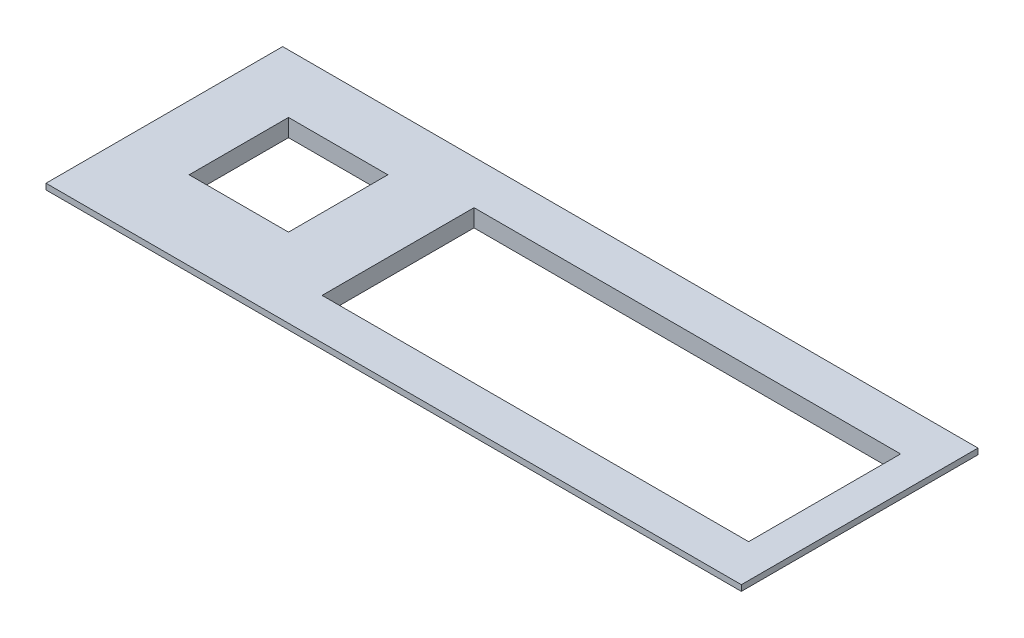
ISO-10303-21;
HEADER;
FILE_DESCRIPTION(('STEP AP214'),'2;1');
FILE_NAME('part.step','',(''),(''),'','','');
FILE_SCHEMA(('AUTOMOTIVE_DESIGN { 1 0 10303 214 1 1 1 1 }'));
ENDSEC;
DATA;
#1=APPLICATION_CONTEXT('core data for automotive mechanical design processes');
#2=APPLICATION_PROTOCOL_DEFINITION('international standard','automotive_design',2000,#1);
#3=PRODUCT_CONTEXT('',#1,'mechanical');
#4=PRODUCT('Part','Part','',(#3));
#5=PRODUCT_RELATED_PRODUCT_CATEGORY('part','',(#4));
#6=PRODUCT_DEFINITION_FORMATION('','',#4);
#7=PRODUCT_DEFINITION_CONTEXT('part definition',#1,'design');
#8=PRODUCT_DEFINITION('design','',#6,#7);
#9=PRODUCT_DEFINITION_SHAPE('','',#8);
#10=(LENGTH_UNIT() NAMED_UNIT(*) SI_UNIT(.MILLI.,.METRE.));
#11=(NAMED_UNIT(*) PLANE_ANGLE_UNIT() SI_UNIT($,.RADIAN.));
#12=(NAMED_UNIT(*) SI_UNIT($,.STERADIAN.) SOLID_ANGLE_UNIT());
#13=UNCERTAINTY_MEASURE_WITH_UNIT(LENGTH_MEASURE(1.E-05),#10,'distance_accuracy_value','');
#14=(GEOMETRIC_REPRESENTATION_CONTEXT(3) GLOBAL_UNCERTAINTY_ASSIGNED_CONTEXT((#13)) GLOBAL_UNIT_ASSIGNED_CONTEXT((#10,
#11,#12)) REPRESENTATION_CONTEXT('',''));
#15=CARTESIAN_POINT('',(0.,0.,0.));
#16=DIRECTION('',(0.,0.,1.));
#17=DIRECTION('',(1.,0.,0.));
#18=AXIS2_PLACEMENT_3D('',#15,#16,#17);
#19=CARTESIAN_POINT('',(0.,21.,0.));
#20=DIRECTION('',(0.,1.,0.));
#21=DIRECTION('',(0.,0.,1.));
#22=AXIS2_PLACEMENT_3D('',#19,#20,#21);
#23=PLANE('',#22);
#24=DIRECTION('',(1.,0.,0.));
#25=VECTOR('',#24,1.);
#26=CARTESIAN_POINT('',(-48.5,21.,6.75000000000001));
#27=LINE('',#26,#25);
#28=CARTESIAN_POINT('',(-48.5,21.,6.75000000000001));
#29=VERTEX_POINT('',#28);
#30=CARTESIAN_POINT('',(-31.5,21.,6.75000000000001));
#31=VERTEX_POINT('',#30);
#32=EDGE_CURVE('E264',#29,#31,#27,.T.);
#33=ORIENTED_EDGE('',*,*,#32,.T.);
#34=DIRECTION('',(0.,0.,-1.));
#35=VECTOR('',#34,1.);
#36=CARTESIAN_POINT('',(-31.5,21.,6.75000000000001));
#37=LINE('',#36,#35);
#38=CARTESIAN_POINT('',(-31.5,21.,-10.25));
#39=VERTEX_POINT('',#38);
#40=EDGE_CURVE('E259',#31,#39,#37,.T.);
#41=ORIENTED_EDGE('',*,*,#40,.T.);
#42=DIRECTION('',(-1.,0.,0.));
#43=VECTOR('',#42,1.);
#44=CARTESIAN_POINT('',(-48.5,21.,-10.25));
#45=LINE('',#44,#43);
#46=CARTESIAN_POINT('',(-48.5,21.,-10.25));
#47=VERTEX_POINT('',#46);
#48=EDGE_CURVE('E278',#39,#47,#45,.T.);
#49=ORIENTED_EDGE('',*,*,#48,.T.);
#50=DIRECTION('',(0.,0.,1.));
#51=VECTOR('',#50,1.);
#52=CARTESIAN_POINT('',(-48.5,21.,6.75000000000001));
#53=LINE('',#52,#51);
#54=EDGE_CURVE('E282',#47,#29,#53,.T.);
#55=ORIENTED_EDGE('',*,*,#54,.T.);
#56=EDGE_LOOP('',(#33,#41,#49,#55));
#57=FACE_BOUND('',#56,.T.);
#58=DIRECTION('',(1.,0.,0.));
#59=VECTOR('',#58,1.);
#60=CARTESIAN_POINT('',(-19.25,21.,13.25));
#61=LINE('',#60,#59);
#62=CARTESIAN_POINT('',(-19.25,21.,13.25));
#63=VERTEX_POINT('',#62);
#64=CARTESIAN_POINT('',(53.75,21.,13.25));
#65=VERTEX_POINT('',#64);
#66=EDGE_CURVE('E221',#63,#65,#61,.T.);
#67=ORIENTED_EDGE('',*,*,#66,.T.);
#68=DIRECTION('',(0.,0.,-1.));
#69=VECTOR('',#68,1.);
#70=CARTESIAN_POINT('',(53.75,21.,13.25));
#71=LINE('',#70,#69);
#72=CARTESIAN_POINT('',(53.75,21.,-12.75));
#73=VERTEX_POINT('',#72);
#74=EDGE_CURVE('E211',#65,#73,#71,.T.);
#75=ORIENTED_EDGE('',*,*,#74,.T.);
#76=DIRECTION('',(-1.,0.,0.));
#77=VECTOR('',#76,1.);
#78=CARTESIAN_POINT('',(-19.25,21.,-12.75));
#79=LINE('',#78,#77);
#80=CARTESIAN_POINT('',(-19.25,21.,-12.75));
#81=VERTEX_POINT('',#80);
#82=EDGE_CURVE('E235',#73,#81,#79,.T.);
#83=ORIENTED_EDGE('',*,*,#82,.T.);
#84=DIRECTION('',(0.,0.,1.));
#85=VECTOR('',#84,1.);
#86=CARTESIAN_POINT('',(-19.25,21.,13.25));
#87=LINE('',#86,#85);
#88=EDGE_CURVE('E239',#81,#63,#87,.T.);
#89=ORIENTED_EDGE('',*,*,#88,.T.);
#90=EDGE_LOOP('',(#67,#75,#83,#89));
#91=FACE_BOUND('',#90,.T.);
#92=DIRECTION('',(1.,0.,0.));
#93=VECTOR('',#92,1.);
#94=CARTESIAN_POINT('',(0.,21.,-18.25));
#95=LINE('',#94,#93);
#96=CARTESIAN_POINT('',(-57.5,21.,-18.25));
#97=VERTEX_POINT('',#96);
#98=CARTESIAN_POINT('',(57.5,21.,-18.25));
#99=VERTEX_POINT('',#98);
#100=EDGE_CURVE('E57',#97,#99,#95,.T.);
#101=ORIENTED_EDGE('',*,*,#100,.T.);
#102=DIRECTION('',(0.,0.,1.));
#103=VECTOR('',#102,1.);
#104=CARTESIAN_POINT('',(57.5,21.,0.));
#105=LINE('',#104,#103);
#106=CARTESIAN_POINT('',(57.5,21.,18.25));
#107=VERTEX_POINT('',#106);
#108=EDGE_CURVE('E179',#99,#107,#105,.T.);
#109=ORIENTED_EDGE('',*,*,#108,.T.);
#110=DIRECTION('',(-1.,0.,0.));
#111=VECTOR('',#110,1.);
#112=CARTESIAN_POINT('',(0.,21.,18.25));
#113=LINE('',#112,#111);
#114=CARTESIAN_POINT('',(-57.5,21.,18.25));
#115=VERTEX_POINT('',#114);
#116=EDGE_CURVE('E183',#107,#115,#113,.T.);
#117=ORIENTED_EDGE('',*,*,#116,.T.);
#118=DIRECTION('',(0.,0.,-1.));
#119=VECTOR('',#118,1.);
#120=CARTESIAN_POINT('',(-57.5,21.,0.));
#121=LINE('',#120,#119);
#122=EDGE_CURVE('E202',#115,#97,#121,.T.);
#123=ORIENTED_EDGE('',*,*,#122,.T.);
#124=EDGE_LOOP('',(#101,#109,#117,#123));
#125=FACE_BOUND('',#124,.T.);
#126=ADVANCED_FACE('F41',(#57,#91,#125),#23,.F.);
#127=CARTESIAN_POINT('',(-59.5,24.,-20.25));
#128=DIRECTION('',(0.,0.,1.));
#129=DIRECTION('',(1.,0.,0.));
#130=AXIS2_PLACEMENT_3D('',#127,#128,#129);
#131=PLANE('',#130);
#132=DIRECTION('',(1.,0.,0.));
#133=VECTOR('',#132,1.);
#134=CARTESIAN_POINT('',(0.,23.,-20.25));
#135=LINE('',#134,#133);
#136=CARTESIAN_POINT('',(-59.5,23.,-20.25));
#137=VERTEX_POINT('',#136);
#138=CARTESIAN_POINT('',(59.5,23.,-20.25));
#139=VERTEX_POINT('',#138);
#140=EDGE_CURVE('E190',#137,#139,#135,.T.);
#141=ORIENTED_EDGE('',*,*,#140,.F.);
#142=DIRECTION('',(0.,-1.,0.));
#143=VECTOR('',#142,1.);
#144=CARTESIAN_POINT('',(-59.5,24.,-20.25));
#145=LINE('',#144,#143);
#146=CARTESIAN_POINT('',(-59.5,24.,-20.25));
#147=VERTEX_POINT('',#146);
#148=EDGE_CURVE('E11',#147,#137,#145,.T.);
#149=ORIENTED_EDGE('',*,*,#148,.F.);
#150=DIRECTION('',(-1.,0.,0.));
#151=VECTOR('',#150,1.);
#152=CARTESIAN_POINT('',(-59.5,24.,-20.25));
#153=LINE('',#152,#151);
#154=CARTESIAN_POINT('',(59.5,24.,-20.25));
#155=VERTEX_POINT('',#154);
#156=EDGE_CURVE('E302',#155,#147,#153,.T.);
#157=ORIENTED_EDGE('',*,*,#156,.F.);
#158=DIRECTION('',(0.,-1.,0.));
#159=VECTOR('',#158,1.);
#160=CARTESIAN_POINT('',(59.5,24.,-20.25));
#161=LINE('',#160,#159);
#162=EDGE_CURVE('E315',#155,#139,#161,.T.);
#163=ORIENTED_EDGE('',*,*,#162,.T.);
#164=EDGE_LOOP('',(#141,#149,#157,#163));
#165=FACE_BOUND('',#164,.T.);
#166=ADVANCED_FACE('F43',(#165),#131,.F.);
#167=CARTESIAN_POINT('',(-59.5,24.,-20.25));
#168=DIRECTION('',(1.,0.,0.));
#169=DIRECTION('',(0.,0.,-1.));
#170=AXIS2_PLACEMENT_3D('',#167,#168,#169);
#171=PLANE('',#170);
#172=DIRECTION('',(0.,0.,-1.));
#173=VECTOR('',#172,1.);
#174=CARTESIAN_POINT('',(-59.5,23.,0.));
#175=LINE('',#174,#173);
#176=CARTESIAN_POINT('',(-59.5,23.,20.25));
#177=VERTEX_POINT('',#176);
#178=EDGE_CURVE('E174',#177,#137,#175,.T.);
#179=ORIENTED_EDGE('',*,*,#178,.F.);
#180=DIRECTION('',(0.,-1.,0.));
#181=VECTOR('',#180,1.);
#182=CARTESIAN_POINT('',(-59.5,24.,20.25));
#183=LINE('',#182,#181);
#184=CARTESIAN_POINT('',(-59.5,24.,20.25));
#185=VERTEX_POINT('',#184);
#186=EDGE_CURVE('E50',#185,#177,#183,.T.);
#187=ORIENTED_EDGE('',*,*,#186,.F.);
#188=DIRECTION('',(0.,0.,1.));
#189=VECTOR('',#188,1.);
#190=CARTESIAN_POINT('',(-59.5,24.,-20.25));
#191=LINE('',#190,#189);
#192=EDGE_CURVE('E306',#147,#185,#191,.T.);
#193=ORIENTED_EDGE('',*,*,#192,.F.);
#194=ORIENTED_EDGE('',*,*,#148,.T.);
#195=EDGE_LOOP('',(#179,#187,#193,#194));
#196=FACE_BOUND('',#195,.T.);
#197=ADVANCED_FACE('F331',(#196),#171,.F.);
#198=CARTESIAN_POINT('',(59.5,24.,-20.25));
#199=DIRECTION('',(-1.,0.,0.));
#200=DIRECTION('',(0.,0.,1.));
#201=AXIS2_PLACEMENT_3D('',#198,#199,#200);
#202=PLANE('',#201);
#203=DIRECTION('',(0.,0.,1.));
#204=VECTOR('',#203,1.);
#205=CARTESIAN_POINT('',(59.5,23.,0.));
#206=LINE('',#205,#204);
#207=CARTESIAN_POINT('',(59.5,23.,20.25));
#208=VERTEX_POINT('',#207);
#209=EDGE_CURVE('E65',#139,#208,#206,.T.);
#210=ORIENTED_EDGE('',*,*,#209,.F.);
#211=ORIENTED_EDGE('',*,*,#162,.F.);
#212=DIRECTION('',(0.,0.,-1.));
#213=VECTOR('',#212,1.);
#214=CARTESIAN_POINT('',(59.5,24.,-20.25));
#215=LINE('',#214,#213);
#216=CARTESIAN_POINT('',(59.5,24.,20.25));
#217=VERTEX_POINT('',#216);
#218=EDGE_CURVE('E312',#217,#155,#215,.T.);
#219=ORIENTED_EDGE('',*,*,#218,.F.);
#220=DIRECTION('',(0.,-1.,0.));
#221=VECTOR('',#220,1.);
#222=CARTESIAN_POINT('',(59.5,24.,20.25));
#223=LINE('',#222,#221);
#224=EDGE_CURVE('E319',#217,#208,#223,.T.);
#225=ORIENTED_EDGE('',*,*,#224,.T.);
#226=EDGE_LOOP('',(#210,#211,#219,#225));
#227=FACE_BOUND('',#226,.T.);
#228=ADVANCED_FACE('F339',(#227),#202,.F.);
#229=CARTESIAN_POINT('',(-59.5,24.,20.25));
#230=DIRECTION('',(0.,0.,-1.));
#231=DIRECTION('',(-1.,0.,0.));
#232=AXIS2_PLACEMENT_3D('',#229,#230,#231);
#233=PLANE('',#232);
#234=DIRECTION('',(-1.,0.,0.));
#235=VECTOR('',#234,1.);
#236=CARTESIAN_POINT('',(0.,23.,20.25));
#237=LINE('',#236,#235);
#238=EDGE_CURVE('E195',#208,#177,#237,.T.);
#239=ORIENTED_EDGE('',*,*,#238,.F.);
#240=ORIENTED_EDGE('',*,*,#224,.F.);
#241=DIRECTION('',(1.,0.,0.));
#242=VECTOR('',#241,1.);
#243=CARTESIAN_POINT('',(-59.5,24.,20.25));
#244=LINE('',#243,#242);
#245=EDGE_CURVE('E309',#185,#217,#244,.T.);
#246=ORIENTED_EDGE('',*,*,#245,.F.);
#247=ORIENTED_EDGE('',*,*,#186,.T.);
#248=EDGE_LOOP('',(#239,#240,#246,#247));
#249=FACE_BOUND('',#248,.T.);
#250=ADVANCED_FACE('F327',(#249),#233,.F.);
#251=CARTESIAN_POINT('',(0.,24.,0.));
#252=DIRECTION('',(0.,-1.,0.));
#253=DIRECTION('',(0.,0.,-1.));
#254=AXIS2_PLACEMENT_3D('',#251,#252,#253);
#255=PLANE('',#254);
#256=DIRECTION('',(0.,0.,-1.));
#257=VECTOR('',#256,1.);
#258=CARTESIAN_POINT('',(-31.5,24.,6.75000000000001));
#259=LINE('',#258,#257);
#260=CARTESIAN_POINT('',(-31.5,24.,6.75000000000001));
#261=VERTEX_POINT('',#260);
#262=CARTESIAN_POINT('',(-31.5,24.,-10.25));
#263=VERTEX_POINT('',#262);
#264=EDGE_CURVE('E260',#261,#263,#259,.T.);
#265=ORIENTED_EDGE('',*,*,#264,.F.);
#266=DIRECTION('',(1.,0.,0.));
#267=VECTOR('',#266,1.);
#268=CARTESIAN_POINT('',(-48.5,24.,6.75000000000001));
#269=LINE('',#268,#267);
#270=CARTESIAN_POINT('',(-48.5,24.,6.75000000000001));
#271=VERTEX_POINT('',#270);
#272=EDGE_CURVE('E271',#271,#261,#269,.T.);
#273=ORIENTED_EDGE('',*,*,#272,.F.);
#274=DIRECTION('',(0.,0.,1.));
#275=VECTOR('',#274,1.);
#276=CARTESIAN_POINT('',(-48.5,24.,6.75000000000001));
#277=LINE('',#276,#275);
#278=CARTESIAN_POINT('',(-48.5,24.,-10.25));
#279=VERTEX_POINT('',#278);
#280=EDGE_CURVE('E267',#279,#271,#277,.T.);
#281=ORIENTED_EDGE('',*,*,#280,.F.);
#282=DIRECTION('',(-1.,0.,0.));
#283=VECTOR('',#282,1.);
#284=CARTESIAN_POINT('',(-48.5,24.,-10.25));
#285=LINE('',#284,#283);
#286=EDGE_CURVE('E263',#263,#279,#285,.T.);
#287=ORIENTED_EDGE('',*,*,#286,.F.);
#288=EDGE_LOOP('',(#265,#273,#281,#287));
#289=FACE_BOUND('',#288,.T.);
#290=ORIENTED_EDGE('',*,*,#156,.T.);
#291=ORIENTED_EDGE('',*,*,#192,.T.);
#292=ORIENTED_EDGE('',*,*,#245,.T.);
#293=ORIENTED_EDGE('',*,*,#218,.T.);
#294=EDGE_LOOP('',(#290,#291,#292,#293));
#295=FACE_BOUND('',#294,.T.);
#296=DIRECTION('',(0.,0.,-1.));
#297=VECTOR('',#296,1.);
#298=CARTESIAN_POINT('',(53.75,24.,13.25));
#299=LINE('',#298,#297);
#300=CARTESIAN_POINT('',(53.75,24.,13.25));
#301=VERTEX_POINT('',#300);
#302=CARTESIAN_POINT('',(53.75,24.,-12.75));
#303=VERTEX_POINT('',#302);
#304=EDGE_CURVE('E217',#301,#303,#299,.T.);
#305=ORIENTED_EDGE('',*,*,#304,.F.);
#306=DIRECTION('',(1.,0.,0.));
#307=VECTOR('',#306,1.);
#308=CARTESIAN_POINT('',(-19.25,24.,13.25));
#309=LINE('',#308,#307);
#310=CARTESIAN_POINT('',(-19.25,24.,13.25));
#311=VERTEX_POINT('',#310);
#312=EDGE_CURVE('E228',#311,#301,#309,.T.);
#313=ORIENTED_EDGE('',*,*,#312,.F.);
#314=DIRECTION('',(0.,0.,1.));
#315=VECTOR('',#314,1.);
#316=CARTESIAN_POINT('',(-19.25,24.,13.25));
#317=LINE('',#316,#315);
#318=CARTESIAN_POINT('',(-19.25,24.,-12.75));
#319=VERTEX_POINT('',#318);
#320=EDGE_CURVE('E224',#319,#311,#317,.T.);
#321=ORIENTED_EDGE('',*,*,#320,.F.);
#322=DIRECTION('',(-1.,0.,0.));
#323=VECTOR('',#322,1.);
#324=CARTESIAN_POINT('',(-19.25,24.,-12.75));
#325=LINE('',#324,#323);
#326=EDGE_CURVE('E220',#303,#319,#325,.T.);
#327=ORIENTED_EDGE('',*,*,#326,.F.);
#328=EDGE_LOOP('',(#305,#313,#321,#327));
#329=FACE_BOUND('',#328,.T.);
#330=ADVANCED_FACE('F341',(#289,#295,#329),#255,.F.);
#331=CARTESIAN_POINT('',(-48.5,24.,6.75000000000001));
#332=DIRECTION('',(1.,0.,0.));
#333=DIRECTION('',(0.,0.,-1.));
#334=AXIS2_PLACEMENT_3D('',#331,#332,#333);
#335=PLANE('',#334);
#336=ORIENTED_EDGE('',*,*,#54,.F.);
#337=DIRECTION('',(0.,-1.,0.));
#338=VECTOR('',#337,1.);
#339=CARTESIAN_POINT('',(-48.5,24.,-10.25));
#340=LINE('',#339,#338);
#341=EDGE_CURVE('E295',#279,#47,#340,.T.);
#342=ORIENTED_EDGE('',*,*,#341,.F.);
#343=ORIENTED_EDGE('',*,*,#280,.T.);
#344=DIRECTION('',(0.,-1.,0.));
#345=VECTOR('',#344,1.);
#346=CARTESIAN_POINT('',(-48.5,24.,6.75000000000001));
#347=LINE('',#346,#345);
#348=EDGE_CURVE('E292',#271,#29,#347,.T.);
#349=ORIENTED_EDGE('',*,*,#348,.T.);
#350=EDGE_LOOP('',(#336,#342,#343,#349));
#351=FACE_BOUND('',#350,.T.);
#352=ADVANCED_FACE('F344',(#351),#335,.T.);
#353=CARTESIAN_POINT('',(-48.5,24.,-10.25));
#354=DIRECTION('',(0.,0.,1.));
#355=DIRECTION('',(1.,0.,0.));
#356=AXIS2_PLACEMENT_3D('',#353,#354,#355);
#357=PLANE('',#356);
#358=ORIENTED_EDGE('',*,*,#48,.F.);
#359=DIRECTION('',(0.,-1.,0.));
#360=VECTOR('',#359,1.);
#361=CARTESIAN_POINT('',(-31.5,24.,-10.25));
#362=LINE('',#361,#360);
#363=EDGE_CURVE('E298',#263,#39,#362,.T.);
#364=ORIENTED_EDGE('',*,*,#363,.F.);
#365=ORIENTED_EDGE('',*,*,#286,.T.);
#366=ORIENTED_EDGE('',*,*,#341,.T.);
#367=EDGE_LOOP('',(#358,#364,#365,#366));
#368=FACE_BOUND('',#367,.T.);
#369=ADVANCED_FACE('F454',(#368),#357,.T.);
#370=CARTESIAN_POINT('',(-31.5,24.,6.75000000000001));
#371=DIRECTION('',(-1.,0.,0.));
#372=DIRECTION('',(0.,0.,1.));
#373=AXIS2_PLACEMENT_3D('',#370,#371,#372);
#374=PLANE('',#373);
#375=ORIENTED_EDGE('',*,*,#40,.F.);
#376=DIRECTION('',(0.,-1.,0.));
#377=VECTOR('',#376,1.);
#378=CARTESIAN_POINT('',(-31.5,24.,6.75000000000001));
#379=LINE('',#378,#377);
#380=EDGE_CURVE('E274',#261,#31,#379,.T.);
#381=ORIENTED_EDGE('',*,*,#380,.F.);
#382=ORIENTED_EDGE('',*,*,#264,.T.);
#383=ORIENTED_EDGE('',*,*,#363,.T.);
#384=EDGE_LOOP('',(#375,#381,#382,#383));
#385=FACE_BOUND('',#384,.T.);
#386=ADVANCED_FACE('F347',(#385),#374,.T.);
#387=CARTESIAN_POINT('',(-48.5,24.,6.75000000000001));
#388=DIRECTION('',(0.,0.,-1.));
#389=DIRECTION('',(-1.,0.,0.));
#390=AXIS2_PLACEMENT_3D('',#387,#388,#389);
#391=PLANE('',#390);
#392=ORIENTED_EDGE('',*,*,#32,.F.);
#393=ORIENTED_EDGE('',*,*,#348,.F.);
#394=ORIENTED_EDGE('',*,*,#272,.T.);
#395=ORIENTED_EDGE('',*,*,#380,.T.);
#396=EDGE_LOOP('',(#392,#393,#394,#395));
#397=FACE_BOUND('',#396,.T.);
#398=ADVANCED_FACE('F368',(#397),#391,.T.);
#399=CARTESIAN_POINT('',(-19.25,24.,13.25));
#400=DIRECTION('',(1.,0.,0.));
#401=DIRECTION('',(0.,0.,-1.));
#402=AXIS2_PLACEMENT_3D('',#399,#400,#401);
#403=PLANE('',#402);
#404=ORIENTED_EDGE('',*,*,#88,.F.);
#405=DIRECTION('',(0.,-1.,0.));
#406=VECTOR('',#405,1.);
#407=CARTESIAN_POINT('',(-19.25,24.,-12.75));
#408=LINE('',#407,#406);
#409=EDGE_CURVE('E252',#319,#81,#408,.T.);
#410=ORIENTED_EDGE('',*,*,#409,.F.);
#411=ORIENTED_EDGE('',*,*,#320,.T.);
#412=DIRECTION('',(0.,-1.,0.));
#413=VECTOR('',#412,1.);
#414=CARTESIAN_POINT('',(-19.25,24.,13.25));
#415=LINE('',#414,#413);
#416=EDGE_CURVE('E249',#311,#63,#415,.T.);
#417=ORIENTED_EDGE('',*,*,#416,.T.);
#418=EDGE_LOOP('',(#404,#410,#411,#417));
#419=FACE_BOUND('',#418,.T.);
#420=ADVANCED_FACE('F366',(#419),#403,.T.);
#421=CARTESIAN_POINT('',(-19.25,24.,-12.75));
#422=DIRECTION('',(0.,0.,1.));
#423=DIRECTION('',(1.,0.,0.));
#424=AXIS2_PLACEMENT_3D('',#421,#422,#423);
#425=PLANE('',#424);
#426=ORIENTED_EDGE('',*,*,#82,.F.);
#427=DIRECTION('',(0.,-1.,0.));
#428=VECTOR('',#427,1.);
#429=CARTESIAN_POINT('',(53.75,24.,-12.75));
#430=LINE('',#429,#428);
#431=EDGE_CURVE('E255',#303,#73,#430,.T.);
#432=ORIENTED_EDGE('',*,*,#431,.F.);
#433=ORIENTED_EDGE('',*,*,#326,.T.);
#434=ORIENTED_EDGE('',*,*,#409,.T.);
#435=EDGE_LOOP('',(#426,#432,#433,#434));
#436=FACE_BOUND('',#435,.T.);
#437=ADVANCED_FACE('F357',(#436),#425,.T.);
#438=CARTESIAN_POINT('',(53.75,24.,13.25));
#439=DIRECTION('',(-1.,0.,0.));
#440=DIRECTION('',(0.,0.,1.));
#441=AXIS2_PLACEMENT_3D('',#438,#439,#440);
#442=PLANE('',#441);
#443=ORIENTED_EDGE('',*,*,#74,.F.);
#444=DIRECTION('',(0.,-1.,0.));
#445=VECTOR('',#444,1.);
#446=CARTESIAN_POINT('',(53.75,24.,13.25));
#447=LINE('',#446,#445);
#448=EDGE_CURVE('E231',#301,#65,#447,.T.);
#449=ORIENTED_EDGE('',*,*,#448,.F.);
#450=ORIENTED_EDGE('',*,*,#304,.T.);
#451=ORIENTED_EDGE('',*,*,#431,.T.);
#452=EDGE_LOOP('',(#443,#449,#450,#451));
#453=FACE_BOUND('',#452,.T.);
#454=ADVANCED_FACE('F355',(#453),#442,.T.);
#455=CARTESIAN_POINT('',(-19.25,24.,13.25));
#456=DIRECTION('',(0.,0.,-1.));
#457=DIRECTION('',(-1.,0.,0.));
#458=AXIS2_PLACEMENT_3D('',#455,#456,#457);
#459=PLANE('',#458);
#460=ORIENTED_EDGE('',*,*,#66,.F.);
#461=ORIENTED_EDGE('',*,*,#416,.F.);
#462=ORIENTED_EDGE('',*,*,#312,.T.);
#463=ORIENTED_EDGE('',*,*,#448,.T.);
#464=EDGE_LOOP('',(#460,#461,#462,#463));
#465=FACE_BOUND('',#464,.T.);
#466=ADVANCED_FACE('F364',(#465),#459,.T.);
#467=CARTESIAN_POINT('',(0.,23.,-18.25));
#468=DIRECTION('',(0.,0.,-1.));
#469=DIRECTION('',(-1.,0.,0.));
#470=AXIS2_PLACEMENT_3D('',#467,#468,#469);
#471=PLANE('',#470);
#472=ORIENTED_EDGE('',*,*,#100,.F.);
#473=DIRECTION('',(0.,-1.,0.));
#474=VECTOR('',#473,1.);
#475=CARTESIAN_POINT('',(-57.5,23.,-18.25));
#476=LINE('',#475,#474);
#477=CARTESIAN_POINT('',(-57.5,23.,-18.25));
#478=VERTEX_POINT('',#477);
#479=EDGE_CURVE('E160',#478,#97,#476,.T.);
#480=ORIENTED_EDGE('',*,*,#479,.F.);
#481=DIRECTION('',(1.,0.,0.));
#482=VECTOR('',#481,1.);
#483=CARTESIAN_POINT('',(0.,23.,-18.25));
#484=LINE('',#483,#482);
#485=CARTESIAN_POINT('',(57.5,23.,-18.25));
#486=VERTEX_POINT('',#485);
#487=EDGE_CURVE('E168',#478,#486,#484,.T.);
#488=ORIENTED_EDGE('',*,*,#487,.T.);
#489=DIRECTION('',(0.,-1.,0.));
#490=VECTOR('',#489,1.);
#491=CARTESIAN_POINT('',(57.5,23.,-18.25));
#492=LINE('',#491,#490);
#493=EDGE_CURVE('E208',#486,#99,#492,.T.);
#494=ORIENTED_EDGE('',*,*,#493,.T.);
#495=EDGE_LOOP('',(#472,#480,#488,#494));
#496=FACE_BOUND('',#495,.T.);
#497=ADVANCED_FACE('F171',(#496),#471,.T.);
#498=CARTESIAN_POINT('',(57.5,23.,0.));
#499=DIRECTION('',(1.,0.,0.));
#500=DIRECTION('',(0.,0.,-1.));
#501=AXIS2_PLACEMENT_3D('',#498,#499,#500);
#502=PLANE('',#501);
#503=ORIENTED_EDGE('',*,*,#108,.F.);
#504=ORIENTED_EDGE('',*,*,#493,.F.);
#505=DIRECTION('',(0.,0.,1.));
#506=VECTOR('',#505,1.);
#507=CARTESIAN_POINT('',(57.5,23.,0.));
#508=LINE('',#507,#506);
#509=CARTESIAN_POINT('',(57.5,23.,18.25));
#510=VERTEX_POINT('',#509);
#511=EDGE_CURVE('E177',#486,#510,#508,.T.);
#512=ORIENTED_EDGE('',*,*,#511,.T.);
#513=DIRECTION('',(0.,-1.,0.));
#514=VECTOR('',#513,1.);
#515=CARTESIAN_POINT('',(57.5,23.,18.25));
#516=LINE('',#515,#514);
#517=EDGE_CURVE('E212',#510,#107,#516,.T.);
#518=ORIENTED_EDGE('',*,*,#517,.T.);
#519=EDGE_LOOP('',(#503,#504,#512,#518));
#520=FACE_BOUND('',#519,.T.);
#521=ADVANCED_FACE('F388',(#520),#502,.T.);
#522=CARTESIAN_POINT('',(0.,23.,18.25));
#523=DIRECTION('',(0.,0.,1.));
#524=DIRECTION('',(1.,0.,0.));
#525=AXIS2_PLACEMENT_3D('',#522,#523,#524);
#526=PLANE('',#525);
#527=ORIENTED_EDGE('',*,*,#116,.F.);
#528=ORIENTED_EDGE('',*,*,#517,.F.);
#529=DIRECTION('',(-1.,0.,0.));
#530=VECTOR('',#529,1.);
#531=CARTESIAN_POINT('',(0.,23.,18.25));
#532=LINE('',#531,#530);
#533=CARTESIAN_POINT('',(-57.5,23.,18.25));
#534=VERTEX_POINT('',#533);
#535=EDGE_CURVE('E167',#510,#534,#532,.T.);
#536=ORIENTED_EDGE('',*,*,#535,.T.);
#537=DIRECTION('',(0.,-1.,0.));
#538=VECTOR('',#537,1.);
#539=CARTESIAN_POINT('',(-57.5,23.,18.25));
#540=LINE('',#539,#538);
#541=EDGE_CURVE('E162',#534,#115,#540,.T.);
#542=ORIENTED_EDGE('',*,*,#541,.T.);
#543=EDGE_LOOP('',(#527,#528,#536,#542));
#544=FACE_BOUND('',#543,.T.);
#545=ADVANCED_FACE('F391',(#544),#526,.T.);
#546=CARTESIAN_POINT('',(-57.5,23.,0.));
#547=DIRECTION('',(-1.,0.,0.));
#548=DIRECTION('',(0.,0.,1.));
#549=AXIS2_PLACEMENT_3D('',#546,#547,#548);
#550=PLANE('',#549);
#551=ORIENTED_EDGE('',*,*,#122,.F.);
#552=ORIENTED_EDGE('',*,*,#541,.F.);
#553=DIRECTION('',(0.,0.,-1.));
#554=VECTOR('',#553,1.);
#555=CARTESIAN_POINT('',(-57.5,23.,0.));
#556=LINE('',#555,#554);
#557=EDGE_CURVE('E157',#534,#478,#556,.T.);
#558=ORIENTED_EDGE('',*,*,#557,.T.);
#559=ORIENTED_EDGE('',*,*,#479,.T.);
#560=EDGE_LOOP('',(#551,#552,#558,#559));
#561=FACE_BOUND('',#560,.T.);
#562=ADVANCED_FACE('F159',(#561),#550,.T.);
#563=CARTESIAN_POINT('',(0.,23.,0.));
#564=DIRECTION('',(0.,-1.,0.));
#565=DIRECTION('',(0.,0.,-1.));
#566=AXIS2_PLACEMENT_3D('',#563,#564,#565);
#567=PLANE('',#566);
#568=ORIENTED_EDGE('',*,*,#487,.F.);
#569=ORIENTED_EDGE('',*,*,#557,.F.);
#570=ORIENTED_EDGE('',*,*,#535,.F.);
#571=ORIENTED_EDGE('',*,*,#511,.F.);
#572=EDGE_LOOP('',(#568,#569,#570,#571));
#573=FACE_BOUND('',#572,.T.);
#574=ORIENTED_EDGE('',*,*,#140,.T.);
#575=ORIENTED_EDGE('',*,*,#209,.T.);
#576=ORIENTED_EDGE('',*,*,#238,.T.);
#577=ORIENTED_EDGE('',*,*,#178,.T.);
#578=EDGE_LOOP('',(#574,#575,#576,#577));
#579=FACE_BOUND('',#578,.T.);
#580=ADVANCED_FACE('F176',(#573,#579),#567,.T.);
#581=CLOSED_SHELL('',(#126,#166,#197,#228,#250,#330,#352,#369,#386,#398,#420,#437,#454,#466,
#497,#521,#545,#562,#580));
#582=MANIFOLD_SOLID_BREP('B2',#581);
#583=ADVANCED_BREP_SHAPE_REPRESENTATION('',(#18,#582),#14);
#584=SHAPE_DEFINITION_REPRESENTATION(#9,#583);
ENDSEC;
END-ISO-10303-21;
